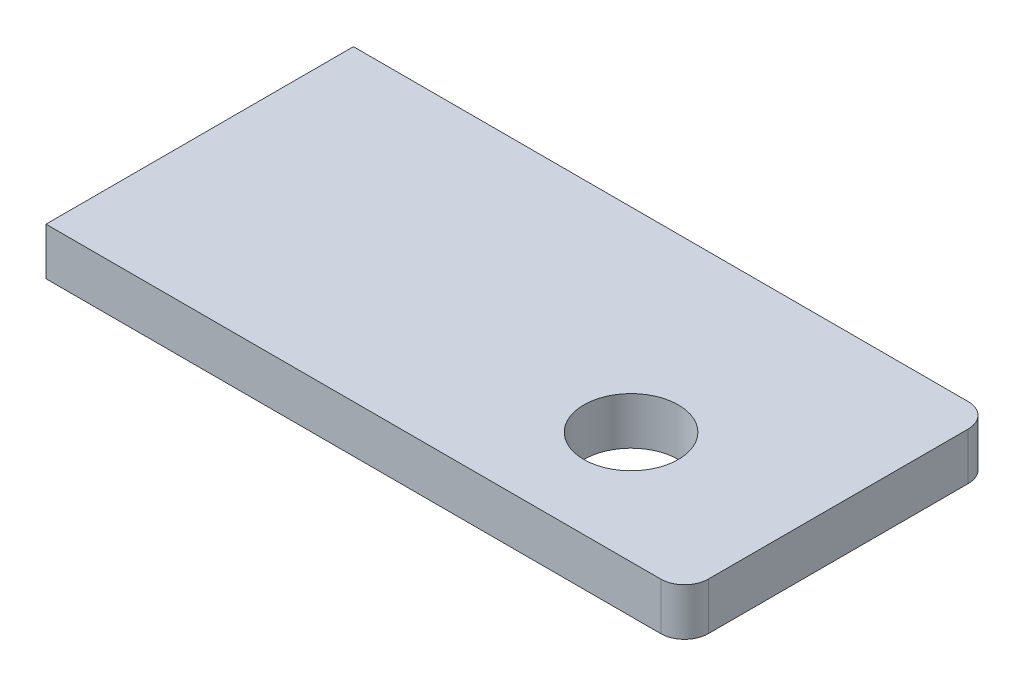
ISO-10303-21;
HEADER;
FILE_DESCRIPTION(('STEP AP214'),'2;1');
FILE_NAME('part.step','',(''),(''),'','','');
FILE_SCHEMA(('AUTOMOTIVE_DESIGN { 1 0 10303 214 1 1 1 1 }'));
ENDSEC;
DATA;
#1=APPLICATION_CONTEXT('core data for automotive mechanical design processes');
#2=APPLICATION_PROTOCOL_DEFINITION('international standard','automotive_design',2000,#1);
#3=PRODUCT_CONTEXT('',#1,'mechanical');
#4=PRODUCT('Part','Part','',(#3));
#5=PRODUCT_RELATED_PRODUCT_CATEGORY('part','',(#4));
#6=PRODUCT_DEFINITION_FORMATION('','',#4);
#7=PRODUCT_DEFINITION_CONTEXT('part definition',#1,'design');
#8=PRODUCT_DEFINITION('design','',#6,#7);
#9=PRODUCT_DEFINITION_SHAPE('','',#8);
#10=(LENGTH_UNIT() NAMED_UNIT(*) SI_UNIT(.MILLI.,.METRE.));
#11=(NAMED_UNIT(*) PLANE_ANGLE_UNIT() SI_UNIT($,.RADIAN.));
#12=(NAMED_UNIT(*) SI_UNIT($,.STERADIAN.) SOLID_ANGLE_UNIT());
#13=UNCERTAINTY_MEASURE_WITH_UNIT(LENGTH_MEASURE(1.E-05),#10,'distance_accuracy_value','');
#14=(GEOMETRIC_REPRESENTATION_CONTEXT(3) GLOBAL_UNCERTAINTY_ASSIGNED_CONTEXT((#13)) GLOBAL_UNIT_ASSIGNED_CONTEXT((#10,
#11,#12)) REPRESENTATION_CONTEXT('',''));
#15=CARTESIAN_POINT('',(0.,0.,0.));
#16=DIRECTION('',(0.,0.,1.));
#17=DIRECTION('',(1.,0.,0.));
#18=AXIS2_PLACEMENT_3D('',#15,#16,#17);
#19=CARTESIAN_POINT('',(0.,2.,1.36416933136206));
#20=DIRECTION('',(0.,0.,1.));
#21=DIRECTION('',(1.,0.,0.));
#22=AXIS2_PLACEMENT_3D('',#19,#20,#21);
#23=PLANE('',#22);
#24=DIRECTION('',(-1.,0.,0.));
#25=VECTOR('',#24,1.);
#26=CARTESIAN_POINT('',(0.,0.,1.36416933136206));
#27=LINE('',#26,#25);
#28=CARTESIAN_POINT('',(13.0239968907526,0.,1.36416933136206));
#29=VERTEX_POINT('',#28);
#30=CARTESIAN_POINT('',(-12.9725382963528,0.,1.36416933136206));
#31=VERTEX_POINT('',#30);
#32=EDGE_CURVE('E127',#29,#31,#27,.T.);
#33=ORIENTED_EDGE('',*,*,#32,.F.);
#34=DIRECTION('',(0.,-1.,0.));
#35=VECTOR('',#34,1.);
#36=CARTESIAN_POINT('',(13.0239968907526,2.,1.36416933136206));
#37=LINE('',#36,#35);
#38=CARTESIAN_POINT('',(13.0239968907526,2.,1.36416933136206));
#39=VERTEX_POINT('',#38);
#40=EDGE_CURVE('E11',#39,#29,#37,.T.);
#41=ORIENTED_EDGE('',*,*,#40,.F.);
#42=DIRECTION('',(-1.,0.,0.));
#43=VECTOR('',#42,1.);
#44=CARTESIAN_POINT('',(0.,2.,1.36416933136206));
#45=LINE('',#44,#43);
#46=CARTESIAN_POINT('',(-12.9725382963528,2.,1.36416933136206));
#47=VERTEX_POINT('',#46);
#48=EDGE_CURVE('E167',#39,#47,#45,.T.);
#49=ORIENTED_EDGE('',*,*,#48,.T.);
#50=DIRECTION('',(0.,-1.,0.));
#51=VECTOR('',#50,1.);
#52=CARTESIAN_POINT('',(-12.9725382963528,2.,1.36416933136206));
#53=LINE('',#52,#51);
#54=EDGE_CURVE('E77',#47,#31,#53,.T.);
#55=ORIENTED_EDGE('',*,*,#54,.T.);
#56=EDGE_LOOP('',(#33,#41,#49,#55));
#57=FACE_BOUND('',#56,.T.);
#58=ADVANCED_FACE('F32',(#57),#23,.T.);
#59=CARTESIAN_POINT('',(13.0239968907526,2.,0.360704518467455));
#60=DIRECTION('',(0.,-1.,0.));
#61=DIRECTION('',(0.,0.,-1.));
#62=AXIS2_PLACEMENT_3D('',#59,#60,#61);
#63=CYLINDRICAL_SURFACE('',#62,1.0034648128946);
#64=CARTESIAN_POINT('',(13.0239968907526,0.,0.360704518467455));
#65=DIRECTION('',(0.,1.,0.));
#66=DIRECTION('',(0.,0.,1.));
#67=AXIS2_PLACEMENT_3D('',#64,#65,#66);
#68=CIRCLE('',#67,1.0034648128946);
#69=CARTESIAN_POINT('',(14.0274617036472,0.,0.360704518467455));
#70=VERTEX_POINT('',#69);
#71=EDGE_CURVE('E125',#29,#70,#68,.T.);
#72=ORIENTED_EDGE('',*,*,#71,.T.);
#73=DIRECTION('',(0.,-1.,0.));
#74=VECTOR('',#73,1.);
#75=CARTESIAN_POINT('',(14.0274617036472,2.,0.360704518467455));
#76=LINE('',#75,#74);
#77=CARTESIAN_POINT('',(14.0274617036472,2.,0.360704518467455));
#78=VERTEX_POINT('',#77);
#79=EDGE_CURVE('E41',#78,#70,#76,.T.);
#80=ORIENTED_EDGE('',*,*,#79,.F.);
#81=CARTESIAN_POINT('',(13.0239968907526,2.,0.360704518467455));
#82=DIRECTION('',(0.,1.,0.));
#83=DIRECTION('',(0.,0.,1.));
#84=AXIS2_PLACEMENT_3D('',#81,#82,#83);
#85=CIRCLE('',#84,1.0034648128946);
#86=EDGE_CURVE('E169',#39,#78,#85,.T.);
#87=ORIENTED_EDGE('',*,*,#86,.F.);
#88=ORIENTED_EDGE('',*,*,#40,.T.);
#89=EDGE_LOOP('',(#72,#80,#87,#88));
#90=FACE_BOUND('',#89,.T.);
#91=ADVANCED_FACE('F126',(#90),#63,.T.);
#92=CARTESIAN_POINT('',(14.0274617036472,2.,0.));
#93=DIRECTION('',(1.,0.,0.));
#94=DIRECTION('',(0.,0.,-1.));
#95=AXIS2_PLACEMENT_3D('',#92,#93,#94);
#96=PLANE('',#95);
#97=DIRECTION('',(0.,0.,1.));
#98=VECTOR('',#97,1.);
#99=CARTESIAN_POINT('',(14.0274617036472,0.,0.));
#100=LINE('',#99,#98);
#101=CARTESIAN_POINT('',(14.0274617036472,0.,-10.6323658557433));
#102=VERTEX_POINT('',#101);
#103=EDGE_CURVE('E122',#102,#70,#100,.T.);
#104=ORIENTED_EDGE('',*,*,#103,.F.);
#105=DIRECTION('',(0.,-1.,0.));
#106=VECTOR('',#105,1.);
#107=CARTESIAN_POINT('',(14.0274617036472,2.,-10.6323658557433));
#108=LINE('',#107,#106);
#109=CARTESIAN_POINT('',(14.0274617036472,2.,-10.6323658557433));
#110=VERTEX_POINT('',#109);
#111=EDGE_CURVE('E111',#110,#102,#108,.T.);
#112=ORIENTED_EDGE('',*,*,#111,.F.);
#113=DIRECTION('',(0.,0.,1.));
#114=VECTOR('',#113,1.);
#115=CARTESIAN_POINT('',(14.0274617036472,2.,0.));
#116=LINE('',#115,#114);
#117=EDGE_CURVE('E105',#110,#78,#116,.T.);
#118=ORIENTED_EDGE('',*,*,#117,.T.);
#119=ORIENTED_EDGE('',*,*,#79,.T.);
#120=EDGE_LOOP('',(#104,#112,#118,#119));
#121=FACE_BOUND('',#120,.T.);
#122=ADVANCED_FACE('F120',(#121),#96,.T.);
#123=CARTESIAN_POINT('',(13.0239968907526,2.,-10.6323658557433));
#124=DIRECTION('',(0.,-1.,0.));
#125=DIRECTION('',(0.,0.,-1.));
#126=AXIS2_PLACEMENT_3D('',#123,#124,#125);
#127=CYLINDRICAL_SURFACE('',#126,1.0034648128946);
#128=CARTESIAN_POINT('',(13.0239968907526,0.,-10.6323658557433));
#129=DIRECTION('',(0.,1.,0.));
#130=DIRECTION('',(0.,0.,1.));
#131=AXIS2_PLACEMENT_3D('',#128,#129,#130);
#132=CIRCLE('',#131,1.0034648128946);
#133=CARTESIAN_POINT('',(13.0239968907526,0.,-11.6358306686379));
#134=VERTEX_POINT('',#133);
#135=EDGE_CURVE('E110',#102,#134,#132,.T.);
#136=ORIENTED_EDGE('',*,*,#135,.T.);
#137=DIRECTION('',(0.,-1.,0.));
#138=VECTOR('',#137,1.);
#139=CARTESIAN_POINT('',(13.0239968907526,2.,-11.6358306686379));
#140=LINE('',#139,#138);
#141=CARTESIAN_POINT('',(13.0239968907526,2.,-11.6358306686379));
#142=VERTEX_POINT('',#141);
#143=EDGE_CURVE('E96',#142,#134,#140,.T.);
#144=ORIENTED_EDGE('',*,*,#143,.F.);
#145=CARTESIAN_POINT('',(13.0239968907526,2.,-10.6323658557433));
#146=DIRECTION('',(0.,1.,0.));
#147=DIRECTION('',(0.,0.,1.));
#148=AXIS2_PLACEMENT_3D('',#145,#146,#147);
#149=CIRCLE('',#148,1.0034648128946);
#150=EDGE_CURVE('E99',#110,#142,#149,.T.);
#151=ORIENTED_EDGE('',*,*,#150,.F.);
#152=ORIENTED_EDGE('',*,*,#111,.T.);
#153=EDGE_LOOP('',(#136,#144,#151,#152));
#154=FACE_BOUND('',#153,.T.);
#155=ADVANCED_FACE('F108',(#154),#127,.T.);
#156=CARTESIAN_POINT('',(0.,2.,-11.6358306686379));
#157=DIRECTION('',(0.,0.,1.));
#158=DIRECTION('',(1.,0.,0.));
#159=AXIS2_PLACEMENT_3D('',#156,#157,#158);
#160=PLANE('',#159);
#161=DIRECTION('',(-1.,0.,0.));
#162=VECTOR('',#161,1.);
#163=CARTESIAN_POINT('',(0.,0.,-11.6358306686379));
#164=LINE('',#163,#162);
#165=CARTESIAN_POINT('',(-12.9725382963528,0.,-11.6358306686379));
#166=VERTEX_POINT('',#165);
#167=EDGE_CURVE('E131',#134,#166,#164,.T.);
#168=ORIENTED_EDGE('',*,*,#167,.T.);
#169=DIRECTION('',(0.,-1.,0.));
#170=VECTOR('',#169,1.);
#171=CARTESIAN_POINT('',(-12.9725382963528,2.,-11.6358306686379));
#172=LINE('',#171,#170);
#173=CARTESIAN_POINT('',(-12.9725382963528,2.,-11.6358306686379));
#174=VERTEX_POINT('',#173);
#175=EDGE_CURVE('E98',#174,#166,#172,.T.);
#176=ORIENTED_EDGE('',*,*,#175,.F.);
#177=DIRECTION('',(-1.,0.,0.));
#178=VECTOR('',#177,1.);
#179=CARTESIAN_POINT('',(0.,2.,-11.6358306686379));
#180=LINE('',#179,#178);
#181=EDGE_CURVE('E91',#142,#174,#180,.T.);
#182=ORIENTED_EDGE('',*,*,#181,.F.);
#183=ORIENTED_EDGE('',*,*,#143,.T.);
#184=EDGE_LOOP('',(#168,#176,#182,#183));
#185=FACE_BOUND('',#184,.T.);
#186=ADVANCED_FACE('F94',(#185),#160,.F.);
#187=CARTESIAN_POINT('',(7.01526717557253,2.,-3.38740458015267));
#188=DIRECTION('',(0.,-1.,0.));
#189=DIRECTION('',(0.,0.,-1.));
#190=AXIS2_PLACEMENT_3D('',#187,#188,#189);
#191=CYLINDRICAL_SURFACE('',#190,2.);
#192=CARTESIAN_POINT('',(7.01526717557253,2.,-3.38740458015267));
#193=DIRECTION('',(0.,1.,0.));
#194=DIRECTION('',(0.,0.,1.));
#195=AXIS2_PLACEMENT_3D('',#192,#193,#194);
#196=CIRCLE('',#195,2.);
#197=CARTESIAN_POINT('',(7.01526717557253,2.,-1.38740458015267));
#198=VERTEX_POINT('',#197);
#199=EDGE_CURVE('E136',#198,#198,#196,.T.);
#200=ORIENTED_EDGE('',*,*,#199,.T.);
#201=EDGE_LOOP('',(#200));
#202=FACE_BOUND('',#201,.T.);
#203=CARTESIAN_POINT('',(7.01526717557253,0.,-3.38740458015267));
#204=DIRECTION('',(0.,1.,0.));
#205=DIRECTION('',(0.,0.,1.));
#206=AXIS2_PLACEMENT_3D('',#203,#204,#205);
#207=CIRCLE('',#206,2.);
#208=CARTESIAN_POINT('',(7.01526717557253,0.,-1.38740458015267));
#209=VERTEX_POINT('',#208);
#210=EDGE_CURVE('E139',#209,#209,#207,.T.);
#211=ORIENTED_EDGE('',*,*,#210,.F.);
#212=EDGE_LOOP('',(#211));
#213=FACE_BOUND('',#212,.T.);
#214=ADVANCED_FACE('F34',(#202,#213),#191,.F.);
#215=CARTESIAN_POINT('',(-12.9725382963528,2.,0.));
#216=DIRECTION('',(1.,0.,0.));
#217=DIRECTION('',(0.,0.,-1.));
#218=AXIS2_PLACEMENT_3D('',#215,#216,#217);
#219=PLANE('',#218);
#220=DIRECTION('',(0.,0.,1.));
#221=VECTOR('',#220,1.);
#222=CARTESIAN_POINT('',(-12.9725382963528,0.,0.));
#223=LINE('',#222,#221);
#224=EDGE_CURVE('E70',#166,#31,#223,.T.);
#225=ORIENTED_EDGE('',*,*,#224,.T.);
#226=ORIENTED_EDGE('',*,*,#54,.F.);
#227=DIRECTION('',(0.,0.,1.));
#228=VECTOR('',#227,1.);
#229=CARTESIAN_POINT('',(-12.9725382963528,2.,0.));
#230=LINE('',#229,#228);
#231=EDGE_CURVE('E49',#174,#47,#230,.T.);
#232=ORIENTED_EDGE('',*,*,#231,.F.);
#233=ORIENTED_EDGE('',*,*,#175,.T.);
#234=EDGE_LOOP('',(#225,#226,#232,#233));
#235=FACE_BOUND('',#234,.T.);
#236=ADVANCED_FACE('F153',(#235),#219,.F.);
#237=CARTESIAN_POINT('',(0.,2.,0.));
#238=DIRECTION('',(0.,1.,0.));
#239=DIRECTION('',(0.,0.,1.));
#240=AXIS2_PLACEMENT_3D('',#237,#238,#239);
#241=PLANE('',#240);
#242=ORIENTED_EDGE('',*,*,#199,.F.);
#243=EDGE_LOOP('',(#242));
#244=FACE_BOUND('',#243,.T.);
#245=ORIENTED_EDGE('',*,*,#48,.F.);
#246=ORIENTED_EDGE('',*,*,#86,.T.);
#247=ORIENTED_EDGE('',*,*,#117,.F.);
#248=ORIENTED_EDGE('',*,*,#150,.T.);
#249=ORIENTED_EDGE('',*,*,#181,.T.);
#250=ORIENTED_EDGE('',*,*,#231,.T.);
#251=EDGE_LOOP('',(#245,#246,#247,#248,#249,#250));
#252=FACE_BOUND('',#251,.T.);
#253=ADVANCED_FACE('F103',(#244,#252),#241,.T.);
#254=CARTESIAN_POINT('',(0.,0.,0.));
#255=DIRECTION('',(0.,1.,0.));
#256=DIRECTION('',(0.,0.,1.));
#257=AXIS2_PLACEMENT_3D('',#254,#255,#256);
#258=PLANE('',#257);
#259=ORIENTED_EDGE('',*,*,#210,.T.);
#260=EDGE_LOOP('',(#259));
#261=FACE_BOUND('',#260,.T.);
#262=ORIENTED_EDGE('',*,*,#32,.T.);
#263=ORIENTED_EDGE('',*,*,#224,.F.);
#264=ORIENTED_EDGE('',*,*,#167,.F.);
#265=ORIENTED_EDGE('',*,*,#135,.F.);
#266=ORIENTED_EDGE('',*,*,#103,.T.);
#267=ORIENTED_EDGE('',*,*,#71,.F.);
#268=EDGE_LOOP('',(#262,#263,#264,#265,#266,#267));
#269=FACE_BOUND('',#268,.T.);
#270=ADVANCED_FACE('F129',(#261,#269),#258,.F.);
#271=CLOSED_SHELL('',(#58,#91,#122,#155,#186,#214,#236,#253,#270));
#272=MANIFOLD_SOLID_BREP('B2',#271);
#273=ADVANCED_BREP_SHAPE_REPRESENTATION('',(#18,#272),#14);
#274=SHAPE_DEFINITION_REPRESENTATION(#9,#273);
ENDSEC;
END-ISO-10303-21;
